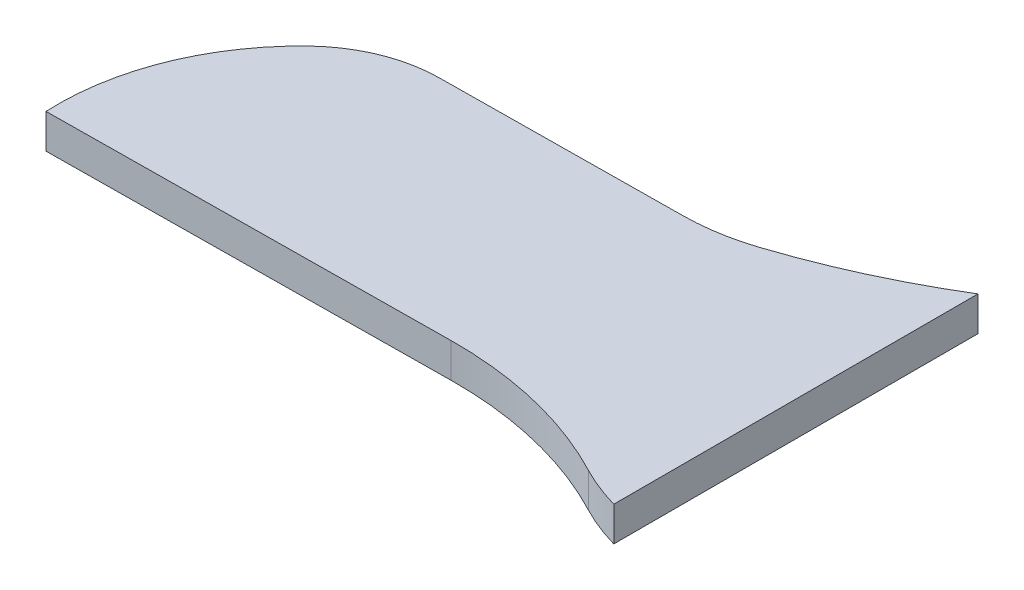
ISO-10303-21;
HEADER;
FILE_DESCRIPTION(('STEP AP214'),'2;1');
FILE_NAME('part.step','',(''),(''),'','','');
FILE_SCHEMA(('AUTOMOTIVE_DESIGN { 1 0 10303 214 1 1 1 1 }'));
ENDSEC;
DATA;
#1=APPLICATION_CONTEXT('core data for automotive mechanical design processes');
#2=APPLICATION_PROTOCOL_DEFINITION('international standard','automotive_design',2000,#1);
#3=PRODUCT_CONTEXT('',#1,'mechanical');
#4=PRODUCT('Part','Part','',(#3));
#5=PRODUCT_RELATED_PRODUCT_CATEGORY('part','',(#4));
#6=PRODUCT_DEFINITION_FORMATION('','',#4);
#7=PRODUCT_DEFINITION_CONTEXT('part definition',#1,'design');
#8=PRODUCT_DEFINITION('design','',#6,#7);
#9=PRODUCT_DEFINITION_SHAPE('','',#8);
#10=(LENGTH_UNIT() NAMED_UNIT(*) SI_UNIT(.MILLI.,.METRE.));
#11=(NAMED_UNIT(*) PLANE_ANGLE_UNIT() SI_UNIT($,.RADIAN.));
#12=(NAMED_UNIT(*) SI_UNIT($,.STERADIAN.) SOLID_ANGLE_UNIT());
#13=UNCERTAINTY_MEASURE_WITH_UNIT(LENGTH_MEASURE(1.E-05),#10,'distance_accuracy_value','');
#14=(GEOMETRIC_REPRESENTATION_CONTEXT(3) GLOBAL_UNCERTAINTY_ASSIGNED_CONTEXT((#13)) GLOBAL_UNIT_ASSIGNED_CONTEXT((#10,
#11,#12)) REPRESENTATION_CONTEXT('',''));
#15=CARTESIAN_POINT('',(0.,0.,0.));
#16=DIRECTION('',(0.,0.,1.));
#17=DIRECTION('',(1.,0.,0.));
#18=AXIS2_PLACEMENT_3D('',#15,#16,#17);
#19=CARTESIAN_POINT('',(103.049255662625,12.7,-83.6040493254907));
#20=DIRECTION('',(0.0101865037744507,0.,0.999948116224463));
#21=DIRECTION('',(0.999948116224464,0.,-0.0101865037744507));
#22=AXIS2_PLACEMENT_3D('',#19,#20,#21);
#23=PLANE('',#22);
#24=DIRECTION('',(-0.999948116224464,0.,0.0101865037744507));
#25=VECTOR('',#24,1.);
#26=CARTESIAN_POINT('',(103.049255662625,0.,-83.6040493254907));
#27=LINE('',#26,#25);
#28=CARTESIAN_POINT('',(206.117467992199,0.,-84.6540085352597));
#29=VERTEX_POINT('',#28);
#30=CARTESIAN_POINT('',(117.064931396584,0.,-83.7468274671252));
#31=VERTEX_POINT('',#30);
#32=EDGE_CURVE('E181',#29,#31,#27,.T.);
#33=ORIENTED_EDGE('',*,*,#32,.T.);
#34=DIRECTION('',(0.,1.,0.));
#35=VECTOR('',#34,1.);
#36=CARTESIAN_POINT('',(117.064931396584,12.7,-83.7468274671252));
#37=LINE('',#36,#35);
#38=CARTESIAN_POINT('',(117.064931396584,12.7,-83.7468274671252));
#39=VERTEX_POINT('',#38);
#40=EDGE_CURVE('E149',#31,#39,#37,.T.);
#41=ORIENTED_EDGE('',*,*,#40,.T.);
#42=DIRECTION('',(-0.999948116224464,0.,0.0101865037744507));
#43=VECTOR('',#42,1.);
#44=CARTESIAN_POINT('',(103.049255662625,12.7,-83.6040493254907));
#45=LINE('',#44,#43);
#46=CARTESIAN_POINT('',(206.117467992199,12.7,-84.6540085352597));
#47=VERTEX_POINT('',#46);
#48=EDGE_CURVE('E136',#47,#39,#45,.T.);
#49=ORIENTED_EDGE('',*,*,#48,.F.);
#50=DIRECTION('',(0.,1.,0.));
#51=VECTOR('',#50,1.);
#52=CARTESIAN_POINT('',(206.117467992199,0.,-84.6540085352597));
#53=LINE('',#52,#51);
#54=EDGE_CURVE('E146',#47,#29,#53,.F.);
#55=ORIENTED_EDGE('',*,*,#54,.T.);
#56=EDGE_LOOP('',(#33,#41,#49,#55));
#57=FACE_BOUND('',#56,.T.);
#58=ADVANCED_FACE('F35',(#57),#23,.F.);
#59=CARTESIAN_POINT('',(117.574256585307,0.,-33.749421655902));
#60=DIRECTION('',(0.,1.,0.));
#61=DIRECTION('',(0.,0.,1.));
#62=AXIS2_PLACEMENT_3D('',#59,#60,#61);
#63=CYLINDRICAL_SURFACE('',#62,50.);
#64=CARTESIAN_POINT('',(117.574256585307,0.,-33.749421655902));
#65=DIRECTION('',(0.,-1.,0.));
#66=DIRECTION('',(0.,0.,-1.));
#67=AXIS2_PLACEMENT_3D('',#64,#65,#66);
#68=CIRCLE('',#67,50.);
#69=CARTESIAN_POINT('',(82.9102152974684,0.,-69.7827984279317));
#70=VERTEX_POINT('',#69);
#71=EDGE_CURVE('E119',#70,#31,#68,.T.);
#72=ORIENTED_EDGE('',*,*,#71,.F.);
#73=DIRECTION('',(0.,1.,0.));
#74=VECTOR('',#73,1.);
#75=CARTESIAN_POINT('',(82.9102152974684,0.,-69.7827984279317));
#76=LINE('',#75,#74);
#77=CARTESIAN_POINT('',(82.9102152974684,12.7,-69.7827984279317));
#78=VERTEX_POINT('',#77);
#79=EDGE_CURVE('E120',#78,#70,#76,.F.);
#80=ORIENTED_EDGE('',*,*,#79,.F.);
#81=CARTESIAN_POINT('',(117.574256585307,12.7,-33.749421655902));
#82=DIRECTION('',(0.,-1.,0.));
#83=DIRECTION('',(0.,0.,-1.));
#84=AXIS2_PLACEMENT_3D('',#81,#82,#83);
#85=CIRCLE('',#84,50.);
#86=EDGE_CURVE('E124',#39,#78,#85,.F.);
#87=ORIENTED_EDGE('',*,*,#86,.F.);
#88=ORIENTED_EDGE('',*,*,#40,.F.);
#89=EDGE_LOOP('',(#72,#80,#87,#88));
#90=FACE_BOUND('',#89,.T.);
#91=ADVANCED_FACE('F201',(#90),#63,.T.);
#92=CARTESIAN_POINT('',(145.305489615577,0.,-4.92272023827828));
#93=DIRECTION('',(0.,1.,0.));
#94=DIRECTION('',(0.,0.,1.));
#95=AXIS2_PLACEMENT_3D('',#92,#93,#94);
#96=CYLINDRICAL_SURFACE('',#95,90.);
#97=CARTESIAN_POINT('',(145.305489615577,12.7,-4.92272023827828));
#98=DIRECTION('',(0.,-1.,0.));
#99=DIRECTION('',(0.,0.,-1.));
#100=AXIS2_PLACEMENT_3D('',#97,#98,#99);
#101=CIRCLE('',#100,90.);
#102=CARTESIAN_POINT('',(55.4110754767808,12.700006,-0.564474416554522));
#103=VERTEX_POINT('',#102);
#104=EDGE_CURVE('E162',#78,#103,#101,.F.);
#105=ORIENTED_EDGE('',*,*,#104,.F.);
#106=ORIENTED_EDGE('',*,*,#79,.T.);
#107=CARTESIAN_POINT('',(145.305489615577,0.,-4.92272023827828));
#108=DIRECTION('',(0.,-1.,0.));
#109=DIRECTION('',(0.,0.,1.));
#110=AXIS2_PLACEMENT_3D('',#107,#108,#109);
#111=CIRCLE('',#110,90.);
#112=CARTESIAN_POINT('',(55.4110754767808,0.,-0.564474416554494));
#113=VERTEX_POINT('',#112);
#114=EDGE_CURVE('E194',#113,#70,#111,.T.);
#115=ORIENTED_EDGE('',*,*,#114,.F.);
#116=DIRECTION('',(0.,1.,0.));
#117=VECTOR('',#116,1.);
#118=CARTESIAN_POINT('',(55.4110754767808,0.,-0.564474416554522));
#119=LINE('',#118,#117);
#120=EDGE_CURVE('E166',#113,#103,#119,.T.);
#121=ORIENTED_EDGE('',*,*,#120,.T.);
#122=EDGE_LOOP('',(#105,#106,#115,#121));
#123=FACE_BOUND('',#122,.T.);
#124=ADVANCED_FACE('F205',(#123),#96,.T.);
#125=CARTESIAN_POINT('',(0.,12.7,0.));
#126=DIRECTION('',(-0.0101865037744501,0.,-0.999948116224463));
#127=DIRECTION('',(-0.999948116224464,0.,0.0101865037744501));
#128=AXIS2_PLACEMENT_3D('',#125,#126,#127);
#129=PLANE('',#128);
#130=DIRECTION('',(0.999948116224463,0.,-0.0101865037744501));
#131=VECTOR('',#130,1.);
#132=CARTESIAN_POINT('',(0.,12.7,0.));
#133=LINE('',#132,#131);
#134=CARTESIAN_POINT('',(203.2,12.7,-2.07000496664132));
#135=VERTEX_POINT('',#134);
#136=EDGE_CURVE('E159',#103,#135,#133,.T.);
#137=ORIENTED_EDGE('',*,*,#136,.F.);
#138=ORIENTED_EDGE('',*,*,#120,.F.);
#139=DIRECTION('',(0.999948116224463,0.,-0.0101865037744501));
#140=VECTOR('',#139,1.);
#141=CARTESIAN_POINT('',(0.,0.,0.));
#142=LINE('',#141,#140);
#143=CARTESIAN_POINT('',(203.2,0.,-2.07000496664132));
#144=VERTEX_POINT('',#143);
#145=EDGE_CURVE('E165',#113,#144,#142,.T.);
#146=ORIENTED_EDGE('',*,*,#145,.T.);
#147=DIRECTION('',(0.,-1.,0.));
#148=VECTOR('',#147,1.);
#149=CARTESIAN_POINT('',(203.2,12.7,-2.07000496664132));
#150=LINE('',#149,#148);
#151=EDGE_CURVE('E150',#135,#144,#150,.T.);
#152=ORIENTED_EDGE('',*,*,#151,.F.);
#153=EDGE_LOOP('',(#137,#138,#146,#152));
#154=FACE_BOUND('',#153,.T.);
#155=ADVANCED_FACE('F189',(#154),#129,.F.);
#156=CARTESIAN_POINT('',(205.302547690243,12.7,-164.649857833217));
#157=DIRECTION('',(0.,-1.,0.));
#158=DIRECTION('',(0.,0.,-1.));
#159=AXIS2_PLACEMENT_3D('',#156,#157,#158);
#160=CYLINDRICAL_SURFACE('',#159,80.);
#161=CARTESIAN_POINT('',(205.302547690243,12.7,-164.649857833217));
#162=DIRECTION('',(0.,-1.,0.));
#163=DIRECTION('',(0.,0.,-1.));
#164=AXIS2_PLACEMENT_3D('',#161,#162,#163);
#165=CIRCLE('',#164,80.);
#166=CARTESIAN_POINT('',(230.21705673357,12.7,-88.6283658777839));
#167=VERTEX_POINT('',#166);
#168=EDGE_CURVE('E43',#167,#47,#165,.T.);
#169=ORIENTED_EDGE('',*,*,#168,.F.);
#170=DIRECTION('',(0.,-1.,0.));
#171=VECTOR('',#170,1.);
#172=CARTESIAN_POINT('',(230.21705673357,12.7,-88.6283658777838));
#173=LINE('',#172,#171);
#174=CARTESIAN_POINT('',(230.21705673357,0.,-88.6283658777839));
#175=VERTEX_POINT('',#174);
#176=EDGE_CURVE('E122',#175,#167,#173,.F.);
#177=ORIENTED_EDGE('',*,*,#176,.F.);
#178=CARTESIAN_POINT('',(205.302547690243,0.,-164.649857833217));
#179=DIRECTION('',(0.,-1.,0.));
#180=DIRECTION('',(0.,0.,-1.));
#181=AXIS2_PLACEMENT_3D('',#178,#179,#180);
#182=CIRCLE('',#181,80.);
#183=EDGE_CURVE('E130',#29,#175,#182,.F.);
#184=ORIENTED_EDGE('',*,*,#183,.F.);
#185=ORIENTED_EDGE('',*,*,#54,.F.);
#186=EDGE_LOOP('',(#169,#177,#184,#185));
#187=FACE_BOUND('',#186,.T.);
#188=ADVANCED_FACE('F152',(#187),#160,.F.);
#189=CARTESIAN_POINT('',(204.629659123049,12.7,138.271075603287));
#190=DIRECTION('',(0.,-1.,0.));
#191=DIRECTION('',(0.,0.,-1.));
#192=AXIS2_PLACEMENT_3D('',#189,#190,#191);
#193=CYLINDRICAL_SURFACE('',#192,140.348362372859);
#194=CARTESIAN_POINT('',(204.629659123049,0.,138.271075603287));
#195=DIRECTION('',(0.,-1.,0.));
#196=DIRECTION('',(0.,0.,-1.));
#197=AXIS2_PLACEMENT_3D('',#194,#195,#196);
#198=CIRCLE('',#197,140.348362372859);
#199=CARTESIAN_POINT('',(269.799992198302,0.,13.9710735614373));
#200=VERTEX_POINT('',#199);
#201=EDGE_CURVE('E178',#144,#200,#198,.T.);
#202=ORIENTED_EDGE('',*,*,#201,.T.);
#203=DIRECTION('',(0.,-1.,0.));
#204=VECTOR('',#203,1.);
#205=CARTESIAN_POINT('',(269.799992198302,12.7,13.9710735614373));
#206=LINE('',#205,#204);
#207=CARTESIAN_POINT('',(269.799992198302,12.7,13.9710735614373));
#208=VERTEX_POINT('',#207);
#209=EDGE_CURVE('E118',#200,#208,#206,.F.);
#210=ORIENTED_EDGE('',*,*,#209,.T.);
#211=CARTESIAN_POINT('',(204.629659123049,12.7,138.271075603287));
#212=DIRECTION('',(0.,-1.,0.));
#213=DIRECTION('',(0.,0.,-1.));
#214=AXIS2_PLACEMENT_3D('',#211,#212,#213);
#215=CIRCLE('',#214,140.348362372859);
#216=EDGE_CURVE('E173',#135,#208,#215,.T.);
#217=ORIENTED_EDGE('',*,*,#216,.F.);
#218=ORIENTED_EDGE('',*,*,#151,.T.);
#219=EDGE_LOOP('',(#202,#210,#217,#218));
#220=FACE_BOUND('',#219,.T.);
#221=ADVANCED_FACE('F192',(#220),#193,.F.);
#222=CARTESIAN_POINT('',(147.792071960619,12.7,-340.131227360892));
#223=DIRECTION('',(0.,-1.,0.));
#224=DIRECTION('',(0.,0.,-1.));
#225=AXIS2_PLACEMENT_3D('',#222,#223,#224);
#226=CYLINDRICAL_SURFACE('',#225,264.665009869104);
#227=CARTESIAN_POINT('',(147.792071960619,12.7,-340.131227360892));
#228=DIRECTION('',(0.,-1.,0.));
#229=DIRECTION('',(0.,0.,1.));
#230=AXIS2_PLACEMENT_3D('',#227,#228,#229);
#231=CIRCLE('',#230,264.665009869104);
#232=CARTESIAN_POINT('',(285.411075476781,12.7,-114.059165132426));
#233=VERTEX_POINT('',#232);
#234=EDGE_CURVE('E138',#233,#167,#231,.T.);
#235=ORIENTED_EDGE('',*,*,#234,.F.);
#236=DIRECTION('',(0.,-1.,0.));
#237=VECTOR('',#236,1.);
#238=CARTESIAN_POINT('',(285.411075476781,12.7,-114.059165132426));
#239=LINE('',#238,#237);
#240=CARTESIAN_POINT('',(285.411075476781,0.,-114.059165132426));
#241=VERTEX_POINT('',#240);
#242=EDGE_CURVE('E197',#233,#241,#239,.T.);
#243=ORIENTED_EDGE('',*,*,#242,.T.);
#244=CARTESIAN_POINT('',(147.792071960619,0.,-340.131227360892));
#245=DIRECTION('',(0.,-1.,0.));
#246=DIRECTION('',(0.,0.,1.));
#247=AXIS2_PLACEMENT_3D('',#244,#245,#246);
#248=CIRCLE('',#247,264.665009869104);
#249=EDGE_CURVE('E57',#241,#175,#248,.T.);
#250=ORIENTED_EDGE('',*,*,#249,.T.);
#251=ORIENTED_EDGE('',*,*,#176,.T.);
#252=EDGE_LOOP('',(#235,#243,#250,#251));
#253=FACE_BOUND('',#252,.T.);
#254=ADVANCED_FACE('F203',(#253),#226,.F.);
#255=CARTESIAN_POINT('',(306.947747668147,12.7,-56.8811971400199));
#256=DIRECTION('',(0.,-1.,0.));
#257=DIRECTION('',(0.,0.,-1.));
#258=AXIS2_PLACEMENT_3D('',#255,#256,#257);
#259=CYLINDRICAL_SURFACE('',#258,80.);
#260=DIRECTION('',(0.,-1.,0.));
#261=VECTOR('',#260,1.);
#262=CARTESIAN_POINT('',(285.411075476781,12.7,20.1653585968956));
#263=LINE('',#262,#261);
#264=CARTESIAN_POINT('',(285.411075476781,12.7,20.1653585968956));
#265=VERTEX_POINT('',#264);
#266=CARTESIAN_POINT('',(285.411075476781,0.,20.1653585968956));
#267=VERTEX_POINT('',#266);
#268=EDGE_CURVE('E12',#265,#267,#263,.T.);
#269=ORIENTED_EDGE('',*,*,#268,.F.);
#270=CARTESIAN_POINT('',(306.947747668147,12.7,-56.8811971400199));
#271=DIRECTION('',(0.,-1.,0.));
#272=DIRECTION('',(0.,0.,-1.));
#273=AXIS2_PLACEMENT_3D('',#270,#271,#272);
#274=CIRCLE('',#273,80.);
#275=EDGE_CURVE('E154',#208,#265,#274,.F.);
#276=ORIENTED_EDGE('',*,*,#275,.F.);
#277=ORIENTED_EDGE('',*,*,#209,.F.);
#278=CARTESIAN_POINT('',(306.947747668147,0.,-56.8811971400199));
#279=DIRECTION('',(0.,-1.,0.));
#280=DIRECTION('',(0.,0.,-1.));
#281=AXIS2_PLACEMENT_3D('',#278,#279,#280);
#282=CIRCLE('',#281,80.);
#283=EDGE_CURVE('E113',#267,#200,#282,.T.);
#284=ORIENTED_EDGE('',*,*,#283,.F.);
#285=EDGE_LOOP('',(#269,#276,#277,#284));
#286=FACE_BOUND('',#285,.T.);
#287=ADVANCED_FACE('F37',(#286),#259,.T.);
#288=CARTESIAN_POINT('',(104.459315348819,0.,54.8130718176911));
#289=DIRECTION('',(0.,-1.,0.));
#290=DIRECTION('',(0.,0.,-1.));
#291=AXIS2_PLACEMENT_3D('',#288,#289,#290);
#292=PLANE('',#291);
#293=DIRECTION('',(0.,0.,-1.));
#294=VECTOR('',#293,1.);
#295=CARTESIAN_POINT('',(285.411075476781,0.,54.8130718176911));
#296=LINE('',#295,#294);
#297=EDGE_CURVE('E106',#267,#241,#296,.T.);
#298=ORIENTED_EDGE('',*,*,#297,.F.);
#299=ORIENTED_EDGE('',*,*,#283,.T.);
#300=ORIENTED_EDGE('',*,*,#201,.F.);
#301=ORIENTED_EDGE('',*,*,#145,.F.);
#302=ORIENTED_EDGE('',*,*,#114,.T.);
#303=ORIENTED_EDGE('',*,*,#71,.T.);
#304=ORIENTED_EDGE('',*,*,#32,.F.);
#305=ORIENTED_EDGE('',*,*,#183,.T.);
#306=ORIENTED_EDGE('',*,*,#249,.F.);
#307=EDGE_LOOP('',(#298,#299,#300,#301,#302,#303,#304,#305,#306));
#308=FACE_BOUND('',#307,.T.);
#309=ADVANCED_FACE('F111',(#308),#292,.T.);
#310=CARTESIAN_POINT('',(104.459315348819,12.7,54.8130718176911));
#311=DIRECTION('',(0.,-1.,0.));
#312=DIRECTION('',(0.,0.,-1.));
#313=AXIS2_PLACEMENT_3D('',#310,#311,#312);
#314=PLANE('',#313);
#315=ORIENTED_EDGE('',*,*,#275,.T.);
#316=DIRECTION('',(0.,0.,-1.));
#317=VECTOR('',#316,1.);
#318=CARTESIAN_POINT('',(285.411075476781,12.7,54.8130718176911));
#319=LINE('',#318,#317);
#320=EDGE_CURVE('E49',#265,#233,#319,.T.);
#321=ORIENTED_EDGE('',*,*,#320,.T.);
#322=ORIENTED_EDGE('',*,*,#234,.T.);
#323=ORIENTED_EDGE('',*,*,#168,.T.);
#324=ORIENTED_EDGE('',*,*,#48,.T.);
#325=ORIENTED_EDGE('',*,*,#86,.T.);
#326=ORIENTED_EDGE('',*,*,#104,.T.);
#327=ORIENTED_EDGE('',*,*,#136,.T.);
#328=ORIENTED_EDGE('',*,*,#216,.T.);
#329=EDGE_LOOP('',(#315,#321,#322,#323,#324,#325,#326,#327,#328));
#330=FACE_BOUND('',#329,.T.);
#331=ADVANCED_FACE('F135',(#330),#314,.F.);
#332=CARTESIAN_POINT('',(285.411075476781,-2.50000000007189E-05,-114.670830678577));
#333=DIRECTION('',(-1.,0.,0.));
#334=DIRECTION('',(0.,0.,1.));
#335=AXIS2_PLACEMENT_3D('',#332,#333,#334);
#336=PLANE('',#335);
#337=ORIENTED_EDGE('',*,*,#320,.F.);
#338=ORIENTED_EDGE('',*,*,#268,.T.);
#339=ORIENTED_EDGE('',*,*,#297,.T.);
#340=ORIENTED_EDGE('',*,*,#242,.F.);
#341=EDGE_LOOP('',(#337,#338,#339,#340));
#342=FACE_BOUND('',#341,.T.);
#343=ADVANCED_FACE('F105',(#342),#336,.F.);
#344=CLOSED_SHELL('',(#58,#91,#124,#155,#188,#221,#254,#287,#309,#331,#343));
#345=MANIFOLD_SOLID_BREP('B2',#344);
#346=ADVANCED_BREP_SHAPE_REPRESENTATION('',(#18,#345),#14);
#347=SHAPE_DEFINITION_REPRESENTATION(#9,#346);
ENDSEC;
END-ISO-10303-21;
